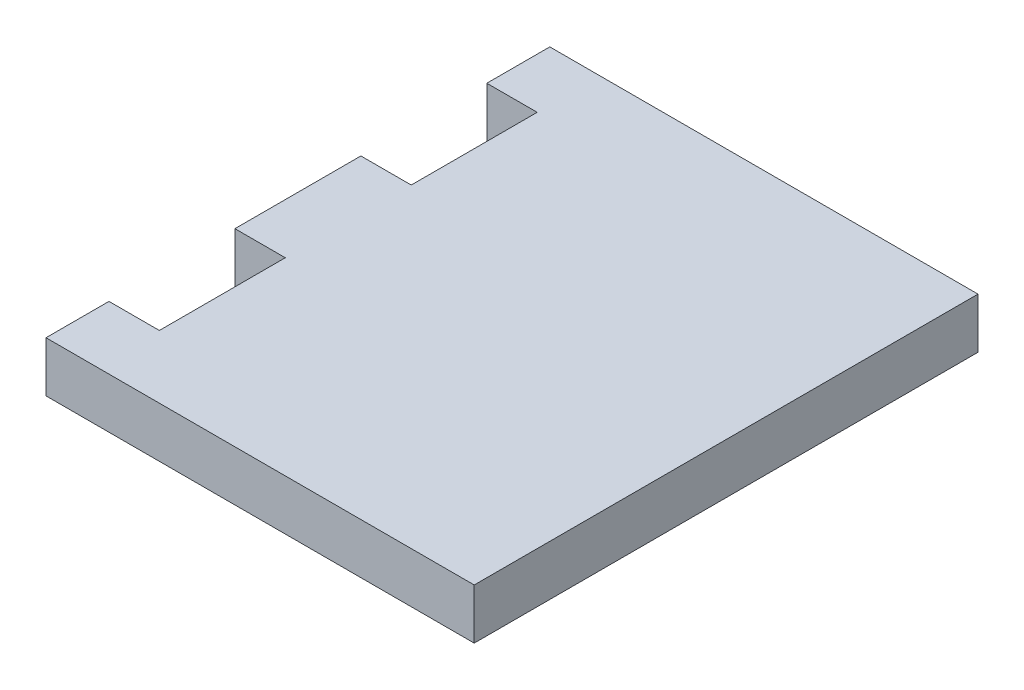
ISO-10303-21;
HEADER;
FILE_DESCRIPTION(('STEP AP214'),'2;1');
FILE_NAME('part.step','',(''),(''),'','','');
FILE_SCHEMA(('AUTOMOTIVE_DESIGN { 1 0 10303 214 1 1 1 1 }'));
ENDSEC;
DATA;
#1=APPLICATION_CONTEXT('core data for automotive mechanical design processes');
#2=APPLICATION_PROTOCOL_DEFINITION('international standard','automotive_design',2000,#1);
#3=PRODUCT_CONTEXT('',#1,'mechanical');
#4=PRODUCT('Part','Part','',(#3));
#5=PRODUCT_RELATED_PRODUCT_CATEGORY('part','',(#4));
#6=PRODUCT_DEFINITION_FORMATION('','',#4);
#7=PRODUCT_DEFINITION_CONTEXT('part definition',#1,'design');
#8=PRODUCT_DEFINITION('design','',#6,#7);
#9=PRODUCT_DEFINITION_SHAPE('','',#8);
#10=(LENGTH_UNIT() NAMED_UNIT(*) SI_UNIT(.MILLI.,.METRE.));
#11=(NAMED_UNIT(*) PLANE_ANGLE_UNIT() SI_UNIT($,.RADIAN.));
#12=(NAMED_UNIT(*) SI_UNIT($,.STERADIAN.) SOLID_ANGLE_UNIT());
#13=UNCERTAINTY_MEASURE_WITH_UNIT(LENGTH_MEASURE(1.E-05),#10,'distance_accuracy_value','');
#14=(GEOMETRIC_REPRESENTATION_CONTEXT(3) GLOBAL_UNCERTAINTY_ASSIGNED_CONTEXT((#13)) GLOBAL_UNIT_ASSIGNED_CONTEXT((#10,
#11,#12)) REPRESENTATION_CONTEXT('',''));
#15=CARTESIAN_POINT('',(0.,0.,0.));
#16=DIRECTION('',(0.,0.,1.));
#17=DIRECTION('',(1.,0.,0.));
#18=AXIS2_PLACEMENT_3D('',#15,#16,#17);
#19=CARTESIAN_POINT('',(0.,2.,0.));
#20=DIRECTION('',(0.,1.,0.));
#21=DIRECTION('',(0.,0.,1.));
#22=AXIS2_PLACEMENT_3D('',#19,#20,#21);
#23=PLANE('',#22);
#24=DIRECTION('',(0.,0.,-1.));
#25=VECTOR('',#24,1.);
#26=CARTESIAN_POINT('',(-2.,2.,10.));
#27=LINE('',#26,#25);
#28=CARTESIAN_POINT('',(-2.,2.,10.));
#29=VERTEX_POINT('',#28);
#30=CARTESIAN_POINT('',(-2.,2.,7.50000000000001));
#31=VERTEX_POINT('',#30);
#32=EDGE_CURVE('E128',#29,#31,#27,.T.);
#33=ORIENTED_EDGE('',*,*,#32,.F.);
#34=DIRECTION('',(1.,0.,0.));
#35=VECTOR('',#34,1.);
#36=CARTESIAN_POINT('',(-15.,2.,10.));
#37=LINE('',#36,#35);
#38=CARTESIAN_POINT('',(15.,2.,10.));
#39=VERTEX_POINT('',#38);
#40=EDGE_CURVE('E140',#29,#39,#37,.T.);
#41=ORIENTED_EDGE('',*,*,#40,.T.);
#42=DIRECTION('',(0.,0.,-1.));
#43=VECTOR('',#42,1.);
#44=CARTESIAN_POINT('',(15.,2.,-9.99999999999999));
#45=LINE('',#44,#43);
#46=CARTESIAN_POINT('',(15.,2.,-9.99999999999999));
#47=VERTEX_POINT('',#46);
#48=EDGE_CURVE('E153',#39,#47,#45,.T.);
#49=ORIENTED_EDGE('',*,*,#48,.T.);
#50=DIRECTION('',(-1.,0.,0.));
#51=VECTOR('',#50,1.);
#52=CARTESIAN_POINT('',(-15.,2.,-9.99999999999999));
#53=LINE('',#52,#51);
#54=CARTESIAN_POINT('',(-2.,2.,-9.99999999999999));
#55=VERTEX_POINT('',#54);
#56=EDGE_CURVE('E150',#47,#55,#53,.T.);
#57=ORIENTED_EDGE('',*,*,#56,.T.);
#58=CARTESIAN_POINT('',(-2.,2.,-7.49999999999999));
#59=VERTEX_POINT('',#58);
#60=EDGE_CURVE('E146',#59,#55,#27,.T.);
#61=ORIENTED_EDGE('',*,*,#60,.F.);
#62=DIRECTION('',(-1.,0.,0.));
#63=VECTOR('',#62,1.);
#64=CARTESIAN_POINT('',(-2.,2.,-7.49999999999999));
#65=LINE('',#64,#63);
#66=CARTESIAN_POINT('',(0.,2.,-7.49999999999999));
#67=VERTEX_POINT('',#66);
#68=EDGE_CURVE('E180',#67,#59,#65,.T.);
#69=ORIENTED_EDGE('',*,*,#68,.F.);
#70=DIRECTION('',(0.,0.,-1.));
#71=VECTOR('',#70,1.);
#72=CARTESIAN_POINT('',(0.,2.,-7.49999999999999));
#73=LINE('',#72,#71);
#74=CARTESIAN_POINT('',(0.,2.,-2.49999999999999));
#75=VERTEX_POINT('',#74);
#76=EDGE_CURVE('E176',#75,#67,#73,.T.);
#77=ORIENTED_EDGE('',*,*,#76,.F.);
#78=DIRECTION('',(1.,0.,0.));
#79=VECTOR('',#78,1.);
#80=CARTESIAN_POINT('',(-2.,2.,-2.49999999999999));
#81=LINE('',#80,#79);
#82=CARTESIAN_POINT('',(-2.,2.,-2.49999999999999));
#83=VERTEX_POINT('',#82);
#84=EDGE_CURVE('E189',#83,#75,#81,.T.);
#85=ORIENTED_EDGE('',*,*,#84,.F.);
#86=CARTESIAN_POINT('',(-2.,2.,2.50000000000001));
#87=VERTEX_POINT('',#86);
#88=EDGE_CURVE('E144',#87,#83,#27,.T.);
#89=ORIENTED_EDGE('',*,*,#88,.F.);
#90=DIRECTION('',(-1.,0.,0.));
#91=VECTOR('',#90,1.);
#92=CARTESIAN_POINT('',(-2.,2.,2.50000000000001));
#93=LINE('',#92,#91);
#94=CARTESIAN_POINT('',(0.,2.,2.50000000000001));
#95=VERTEX_POINT('',#94);
#96=EDGE_CURVE('E204',#95,#87,#93,.T.);
#97=ORIENTED_EDGE('',*,*,#96,.F.);
#98=DIRECTION('',(0.,0.,-1.));
#99=VECTOR('',#98,1.);
#100=CARTESIAN_POINT('',(0.,2.,2.50000000000001));
#101=LINE('',#100,#99);
#102=CARTESIAN_POINT('',(0.,2.,7.50000000000001));
#103=VERTEX_POINT('',#102);
#104=EDGE_CURVE('E200',#103,#95,#101,.T.);
#105=ORIENTED_EDGE('',*,*,#104,.F.);
#106=DIRECTION('',(1.,0.,0.));
#107=VECTOR('',#106,1.);
#108=CARTESIAN_POINT('',(-2.,2.,7.50000000000001));
#109=LINE('',#108,#107);
#110=EDGE_CURVE('E143',#31,#103,#109,.T.);
#111=ORIENTED_EDGE('',*,*,#110,.F.);
#112=EDGE_LOOP('',(#33,#41,#49,#57,#61,#69,#77,#85,#89,#97,#105,#111));
#113=FACE_BOUND('',#112,.T.);
#114=ADVANCED_FACE('F35',(#113),#23,.T.);
#115=CARTESIAN_POINT('',(0.,0.,0.));
#116=DIRECTION('',(0.,1.,0.));
#117=DIRECTION('',(0.,0.,1.));
#118=AXIS2_PLACEMENT_3D('',#115,#116,#117);
#119=PLANE('',#118);
#120=DIRECTION('',(1.,0.,0.));
#121=VECTOR('',#120,1.);
#122=CARTESIAN_POINT('',(-15.,0.,10.));
#123=LINE('',#122,#121);
#124=CARTESIAN_POINT('',(-2.,0.,10.));
#125=VERTEX_POINT('',#124);
#126=CARTESIAN_POINT('',(15.,0.,10.));
#127=VERTEX_POINT('',#126);
#128=EDGE_CURVE('E164',#125,#127,#123,.T.);
#129=ORIENTED_EDGE('',*,*,#128,.F.);
#130=DIRECTION('',(0.,0.,-1.));
#131=VECTOR('',#130,1.);
#132=CARTESIAN_POINT('',(-2.,0.,0.));
#133=LINE('',#132,#131);
#134=CARTESIAN_POINT('',(-2.,0.,7.50000000000001));
#135=VERTEX_POINT('',#134);
#136=EDGE_CURVE('E131',#125,#135,#133,.T.);
#137=ORIENTED_EDGE('',*,*,#136,.T.);
#138=DIRECTION('',(1.,0.,0.));
#139=VECTOR('',#138,1.);
#140=CARTESIAN_POINT('',(-2.,0.,7.50000000000001));
#141=LINE('',#140,#139);
#142=CARTESIAN_POINT('',(0.,0.,7.50000000000001));
#143=VERTEX_POINT('',#142);
#144=EDGE_CURVE('E205',#135,#143,#141,.T.);
#145=ORIENTED_EDGE('',*,*,#144,.T.);
#146=DIRECTION('',(0.,0.,-1.));
#147=VECTOR('',#146,1.);
#148=CARTESIAN_POINT('',(0.,0.,2.50000000000001));
#149=LINE('',#148,#147);
#150=CARTESIAN_POINT('',(0.,0.,2.50000000000001));
#151=VERTEX_POINT('',#150);
#152=EDGE_CURVE('E201',#143,#151,#149,.T.);
#153=ORIENTED_EDGE('',*,*,#152,.T.);
#154=DIRECTION('',(-1.,0.,0.));
#155=VECTOR('',#154,1.);
#156=CARTESIAN_POINT('',(-2.,0.,2.50000000000001));
#157=LINE('',#156,#155);
#158=CARTESIAN_POINT('',(-2.,0.,2.50000000000001));
#159=VERTEX_POINT('',#158);
#160=EDGE_CURVE('E58',#151,#159,#157,.T.);
#161=ORIENTED_EDGE('',*,*,#160,.T.);
#162=CARTESIAN_POINT('',(-2.,0.,-2.49999999999999));
#163=VERTEX_POINT('',#162);
#164=EDGE_CURVE('E213',#159,#163,#133,.T.);
#165=ORIENTED_EDGE('',*,*,#164,.T.);
#166=DIRECTION('',(1.,0.,0.));
#167=VECTOR('',#166,1.);
#168=CARTESIAN_POINT('',(-2.,0.,-2.49999999999999));
#169=LINE('',#168,#167);
#170=CARTESIAN_POINT('',(0.,0.,-2.49999999999999));
#171=VERTEX_POINT('',#170);
#172=EDGE_CURVE('E181',#163,#171,#169,.T.);
#173=ORIENTED_EDGE('',*,*,#172,.T.);
#174=DIRECTION('',(0.,0.,-1.));
#175=VECTOR('',#174,1.);
#176=CARTESIAN_POINT('',(0.,0.,-7.49999999999999));
#177=LINE('',#176,#175);
#178=CARTESIAN_POINT('',(0.,0.,-7.49999999999999));
#179=VERTEX_POINT('',#178);
#180=EDGE_CURVE('E177',#171,#179,#177,.T.);
#181=ORIENTED_EDGE('',*,*,#180,.T.);
#182=DIRECTION('',(-1.,0.,0.));
#183=VECTOR('',#182,1.);
#184=CARTESIAN_POINT('',(-2.,0.,-7.49999999999999));
#185=LINE('',#184,#183);
#186=CARTESIAN_POINT('',(-2.,0.,-7.49999999999999));
#187=VERTEX_POINT('',#186);
#188=EDGE_CURVE('E184',#179,#187,#185,.T.);
#189=ORIENTED_EDGE('',*,*,#188,.T.);
#190=CARTESIAN_POINT('',(-2.,0.,-9.99999999999999));
#191=VERTEX_POINT('',#190);
#192=EDGE_CURVE('E214',#187,#191,#133,.T.);
#193=ORIENTED_EDGE('',*,*,#192,.T.);
#194=DIRECTION('',(-1.,0.,0.));
#195=VECTOR('',#194,1.);
#196=CARTESIAN_POINT('',(-15.,0.,-9.99999999999999));
#197=LINE('',#196,#195);
#198=CARTESIAN_POINT('',(15.,0.,-9.99999999999999));
#199=VERTEX_POINT('',#198);
#200=EDGE_CURVE('E160',#199,#191,#197,.T.);
#201=ORIENTED_EDGE('',*,*,#200,.F.);
#202=DIRECTION('',(0.,0.,-1.));
#203=VECTOR('',#202,1.);
#204=CARTESIAN_POINT('',(15.,0.,-9.99999999999999));
#205=LINE('',#204,#203);
#206=EDGE_CURVE('E157',#127,#199,#205,.T.);
#207=ORIENTED_EDGE('',*,*,#206,.F.);
#208=EDGE_LOOP('',(#129,#137,#145,#153,#161,#165,#173,#181,#189,#193,#201,#207));
#209=FACE_BOUND('',#208,.T.);
#210=ADVANCED_FACE('F222',(#209),#119,.F.);
#211=CARTESIAN_POINT('',(15.,2.,-9.99999999999999));
#212=DIRECTION('',(-1.,0.,0.));
#213=DIRECTION('',(0.,0.,1.));
#214=AXIS2_PLACEMENT_3D('',#211,#212,#213);
#215=PLANE('',#214);
#216=ORIENTED_EDGE('',*,*,#206,.T.);
#217=DIRECTION('',(0.,-1.,0.));
#218=VECTOR('',#217,1.);
#219=CARTESIAN_POINT('',(15.,2.,-9.99999999999999));
#220=LINE('',#219,#218);
#221=EDGE_CURVE('E11',#47,#199,#220,.T.);
#222=ORIENTED_EDGE('',*,*,#221,.F.);
#223=ORIENTED_EDGE('',*,*,#48,.F.);
#224=DIRECTION('',(0.,-1.,0.));
#225=VECTOR('',#224,1.);
#226=CARTESIAN_POINT('',(15.,2.,10.));
#227=LINE('',#226,#225);
#228=EDGE_CURVE('E43',#39,#127,#227,.T.);
#229=ORIENTED_EDGE('',*,*,#228,.T.);
#230=EDGE_LOOP('',(#216,#222,#223,#229));
#231=FACE_BOUND('',#230,.T.);
#232=ADVANCED_FACE('F37',(#231),#215,.F.);
#233=CARTESIAN_POINT('',(-15.,2.,-9.99999999999999));
#234=DIRECTION('',(0.,0.,1.));
#235=DIRECTION('',(1.,0.,0.));
#236=AXIS2_PLACEMENT_3D('',#233,#234,#235);
#237=PLANE('',#236);
#238=ORIENTED_EDGE('',*,*,#200,.T.);
#239=DIRECTION('',(0.,1.,0.));
#240=VECTOR('',#239,1.);
#241=CARTESIAN_POINT('',(-2.,-8.,-9.99999999999999));
#242=LINE('',#241,#240);
#243=EDGE_CURVE('E135',#191,#55,#242,.T.);
#244=ORIENTED_EDGE('',*,*,#243,.T.);
#245=ORIENTED_EDGE('',*,*,#56,.F.);
#246=ORIENTED_EDGE('',*,*,#221,.T.);
#247=EDGE_LOOP('',(#238,#244,#245,#246));
#248=FACE_BOUND('',#247,.T.);
#249=ADVANCED_FACE('F267',(#248),#237,.F.);
#250=CARTESIAN_POINT('',(-15.,2.,10.));
#251=DIRECTION('',(0.,0.,-1.));
#252=DIRECTION('',(-1.,0.,0.));
#253=AXIS2_PLACEMENT_3D('',#250,#251,#252);
#254=PLANE('',#253);
#255=ORIENTED_EDGE('',*,*,#40,.F.);
#256=DIRECTION('',(0.,1.,0.));
#257=VECTOR('',#256,1.);
#258=CARTESIAN_POINT('',(-2.,-8.,10.));
#259=LINE('',#258,#257);
#260=EDGE_CURVE('E125',#125,#29,#259,.T.);
#261=ORIENTED_EDGE('',*,*,#260,.F.);
#262=ORIENTED_EDGE('',*,*,#128,.T.);
#263=ORIENTED_EDGE('',*,*,#228,.F.);
#264=EDGE_LOOP('',(#255,#261,#262,#263));
#265=FACE_BOUND('',#264,.T.);
#266=ADVANCED_FACE('F147',(#265),#254,.F.);
#267=CARTESIAN_POINT('',(-2.,2.,-7.49999999999999));
#268=DIRECTION('',(0.,0.,1.));
#269=DIRECTION('',(1.,0.,0.));
#270=AXIS2_PLACEMENT_3D('',#267,#268,#269);
#271=PLANE('',#270);
#272=ORIENTED_EDGE('',*,*,#188,.F.);
#273=DIRECTION('',(0.,-1.,0.));
#274=VECTOR('',#273,1.);
#275=CARTESIAN_POINT('',(0.,2.,-7.49999999999999));
#276=LINE('',#275,#274);
#277=EDGE_CURVE('E173',#67,#179,#276,.T.);
#278=ORIENTED_EDGE('',*,*,#277,.F.);
#279=ORIENTED_EDGE('',*,*,#68,.T.);
#280=DIRECTION('',(0.,-1.,0.));
#281=VECTOR('',#280,1.);
#282=CARTESIAN_POINT('',(-2.,2.,-7.49999999999999));
#283=LINE('',#282,#281);
#284=EDGE_CURVE('E161',#59,#187,#283,.T.);
#285=ORIENTED_EDGE('',*,*,#284,.T.);
#286=EDGE_LOOP('',(#272,#278,#279,#285));
#287=FACE_BOUND('',#286,.T.);
#288=ADVANCED_FACE('F234',(#287),#271,.T.);
#289=CARTESIAN_POINT('',(-2.,2.,-2.49999999999999));
#290=DIRECTION('',(0.,0.,-1.));
#291=DIRECTION('',(-1.,0.,0.));
#292=AXIS2_PLACEMENT_3D('',#289,#290,#291);
#293=PLANE('',#292);
#294=ORIENTED_EDGE('',*,*,#172,.F.);
#295=DIRECTION('',(0.,-1.,0.));
#296=VECTOR('',#295,1.);
#297=CARTESIAN_POINT('',(-2.,2.,-2.49999999999999));
#298=LINE('',#297,#296);
#299=EDGE_CURVE('E169',#83,#163,#298,.T.);
#300=ORIENTED_EDGE('',*,*,#299,.F.);
#301=ORIENTED_EDGE('',*,*,#84,.T.);
#302=DIRECTION('',(0.,-1.,0.));
#303=VECTOR('',#302,1.);
#304=CARTESIAN_POINT('',(0.,2.,-2.49999999999999));
#305=LINE('',#304,#303);
#306=EDGE_CURVE('E171',#75,#171,#305,.T.);
#307=ORIENTED_EDGE('',*,*,#306,.T.);
#308=EDGE_LOOP('',(#294,#300,#301,#307));
#309=FACE_BOUND('',#308,.T.);
#310=ADVANCED_FACE('F226',(#309),#293,.T.);
#311=CARTESIAN_POINT('',(0.,2.,-7.49999999999999));
#312=DIRECTION('',(-1.,0.,0.));
#313=DIRECTION('',(0.,0.,1.));
#314=AXIS2_PLACEMENT_3D('',#311,#312,#313);
#315=PLANE('',#314);
#316=ORIENTED_EDGE('',*,*,#180,.F.);
#317=ORIENTED_EDGE('',*,*,#306,.F.);
#318=ORIENTED_EDGE('',*,*,#76,.T.);
#319=ORIENTED_EDGE('',*,*,#277,.T.);
#320=EDGE_LOOP('',(#316,#317,#318,#319));
#321=FACE_BOUND('',#320,.T.);
#322=ADVANCED_FACE('F231',(#321),#315,.T.);
#323=CARTESIAN_POINT('',(-2.,2.,2.50000000000001));
#324=DIRECTION('',(0.,0.,1.));
#325=DIRECTION('',(1.,0.,0.));
#326=AXIS2_PLACEMENT_3D('',#323,#324,#325);
#327=PLANE('',#326);
#328=ORIENTED_EDGE('',*,*,#160,.F.);
#329=DIRECTION('',(0.,-1.,0.));
#330=VECTOR('',#329,1.);
#331=CARTESIAN_POINT('',(0.,2.,2.50000000000001));
#332=LINE('',#331,#330);
#333=EDGE_CURVE('E198',#95,#151,#332,.T.);
#334=ORIENTED_EDGE('',*,*,#333,.F.);
#335=ORIENTED_EDGE('',*,*,#96,.T.);
#336=DIRECTION('',(0.,-1.,0.));
#337=VECTOR('',#336,1.);
#338=CARTESIAN_POINT('',(-2.,2.,2.50000000000001));
#339=LINE('',#338,#337);
#340=EDGE_CURVE('E187',#87,#159,#339,.T.);
#341=ORIENTED_EDGE('',*,*,#340,.T.);
#342=EDGE_LOOP('',(#328,#334,#335,#341));
#343=FACE_BOUND('',#342,.T.);
#344=ADVANCED_FACE('F242',(#343),#327,.T.);
#345=CARTESIAN_POINT('',(-2.,2.,7.50000000000001));
#346=DIRECTION('',(0.,0.,-1.));
#347=DIRECTION('',(-1.,0.,0.));
#348=AXIS2_PLACEMENT_3D('',#345,#346,#347);
#349=PLANE('',#348);
#350=ORIENTED_EDGE('',*,*,#144,.F.);
#351=DIRECTION('',(0.,-1.,0.));
#352=VECTOR('',#351,1.);
#353=CARTESIAN_POINT('',(-2.,2.,7.50000000000001));
#354=LINE('',#353,#352);
#355=EDGE_CURVE('E195',#31,#135,#354,.T.);
#356=ORIENTED_EDGE('',*,*,#355,.F.);
#357=ORIENTED_EDGE('',*,*,#110,.T.);
#358=DIRECTION('',(0.,-1.,0.));
#359=VECTOR('',#358,1.);
#360=CARTESIAN_POINT('',(0.,2.,7.50000000000001));
#361=LINE('',#360,#359);
#362=EDGE_CURVE('E50',#103,#143,#361,.T.);
#363=ORIENTED_EDGE('',*,*,#362,.T.);
#364=EDGE_LOOP('',(#350,#356,#357,#363));
#365=FACE_BOUND('',#364,.T.);
#366=ADVANCED_FACE('F246',(#365),#349,.T.);
#367=CARTESIAN_POINT('',(0.,2.,2.50000000000001));
#368=DIRECTION('',(-1.,0.,0.));
#369=DIRECTION('',(0.,0.,1.));
#370=AXIS2_PLACEMENT_3D('',#367,#368,#369);
#371=PLANE('',#370);
#372=ORIENTED_EDGE('',*,*,#152,.F.);
#373=ORIENTED_EDGE('',*,*,#362,.F.);
#374=ORIENTED_EDGE('',*,*,#104,.T.);
#375=ORIENTED_EDGE('',*,*,#333,.T.);
#376=EDGE_LOOP('',(#372,#373,#374,#375));
#377=FACE_BOUND('',#376,.T.);
#378=ADVANCED_FACE('F243',(#377),#371,.T.);
#379=CARTESIAN_POINT('',(-2.,-8.,10.));
#380=DIRECTION('',(1.,0.,0.));
#381=DIRECTION('',(0.,0.,-1.));
#382=AXIS2_PLACEMENT_3D('',#379,#380,#381);
#383=PLANE('',#382);
#384=ORIENTED_EDGE('',*,*,#260,.T.);
#385=ORIENTED_EDGE('',*,*,#32,.T.);
#386=ORIENTED_EDGE('',*,*,#355,.T.);
#387=ORIENTED_EDGE('',*,*,#136,.F.);
#388=EDGE_LOOP('',(#384,#385,#386,#387));
#389=FACE_BOUND('',#388,.T.);
#390=ADVANCED_FACE('F127',(#389),#383,.F.);
#391=ORIENTED_EDGE('',*,*,#340,.F.);
#392=ORIENTED_EDGE('',*,*,#88,.T.);
#393=ORIENTED_EDGE('',*,*,#299,.T.);
#394=ORIENTED_EDGE('',*,*,#164,.F.);
#395=EDGE_LOOP('',(#391,#392,#393,#394));
#396=FACE_BOUND('',#395,.T.);
#397=ADVANCED_FACE('F240',(#396),#383,.F.);
#398=ORIENTED_EDGE('',*,*,#284,.F.);
#399=ORIENTED_EDGE('',*,*,#60,.T.);
#400=ORIENTED_EDGE('',*,*,#243,.F.);
#401=ORIENTED_EDGE('',*,*,#192,.F.);
#402=EDGE_LOOP('',(#398,#399,#400,#401));
#403=FACE_BOUND('',#402,.T.);
#404=ADVANCED_FACE('F238',(#403),#383,.F.);
#405=CLOSED_SHELL('',(#114,#210,#232,#249,#266,#288,#310,#322,#344,#366,#378,#390,#397,#404));
#406=MANIFOLD_SOLID_BREP('B2',#405);
#407=ADVANCED_BREP_SHAPE_REPRESENTATION('',(#18,#406),#14);
#408=SHAPE_DEFINITION_REPRESENTATION(#9,#407);
ENDSEC;
END-ISO-10303-21;
